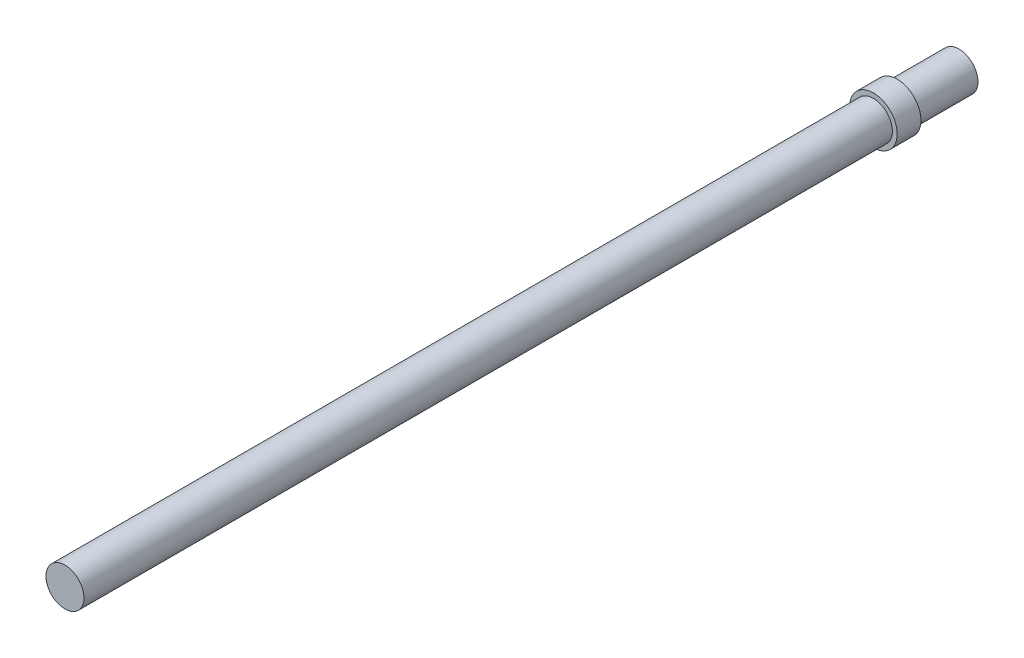
ISO-10303-21;
HEADER;
FILE_DESCRIPTION(('STEP AP214'),'2;1');
FILE_NAME('part.step','',(''),(''),'','','');
FILE_SCHEMA(('AUTOMOTIVE_DESIGN { 1 0 10303 214 1 1 1 1 }'));
ENDSEC;
DATA;
#1=APPLICATION_CONTEXT('core data for automotive mechanical design processes');
#2=APPLICATION_PROTOCOL_DEFINITION('international standard','automotive_design',2000,#1);
#3=PRODUCT_CONTEXT('',#1,'mechanical');
#4=PRODUCT('Part','Part','',(#3));
#5=PRODUCT_RELATED_PRODUCT_CATEGORY('part','',(#4));
#6=PRODUCT_DEFINITION_FORMATION('','',#4);
#7=PRODUCT_DEFINITION_CONTEXT('part definition',#1,'design');
#8=PRODUCT_DEFINITION('design','',#6,#7);
#9=PRODUCT_DEFINITION_SHAPE('','',#8);
#10=(LENGTH_UNIT() NAMED_UNIT(*) SI_UNIT(.MILLI.,.METRE.));
#11=(NAMED_UNIT(*) PLANE_ANGLE_UNIT() SI_UNIT($,.RADIAN.));
#12=(NAMED_UNIT(*) SI_UNIT($,.STERADIAN.) SOLID_ANGLE_UNIT());
#13=UNCERTAINTY_MEASURE_WITH_UNIT(LENGTH_MEASURE(1.E-05),#10,'distance_accuracy_value','');
#14=(GEOMETRIC_REPRESENTATION_CONTEXT(3) GLOBAL_UNCERTAINTY_ASSIGNED_CONTEXT((#13)) GLOBAL_UNIT_ASSIGNED_CONTEXT((#10,
#11,#12)) REPRESENTATION_CONTEXT('',''));
#15=CARTESIAN_POINT('',(0.,0.,0.));
#16=DIRECTION('',(0.,0.,1.));
#17=DIRECTION('',(1.,0.,0.));
#18=AXIS2_PLACEMENT_3D('',#15,#16,#17);
#19=CARTESIAN_POINT('',(0.,0.,170.));
#20=DIRECTION('',(0.,0.,-1.));
#21=DIRECTION('',(-1.,0.,0.));
#22=AXIS2_PLACEMENT_3D('',#19,#20,#21);
#23=CYLINDRICAL_SURFACE('',#22,4.);
#24=CARTESIAN_POINT('',(0.,0.,170.));
#25=DIRECTION('',(0.,0.,1.));
#26=DIRECTION('',(1.,0.,0.));
#27=AXIS2_PLACEMENT_3D('',#24,#25,#26);
#28=CIRCLE('',#27,4.);
#29=CARTESIAN_POINT('',(4.,0.,170.));
#30=VERTEX_POINT('',#29);
#31=EDGE_CURVE('E10',#30,#30,#28,.T.);
#32=ORIENTED_EDGE('',*,*,#31,.F.);
#33=EDGE_LOOP('',(#32));
#34=FACE_BOUND('',#33,.T.);
#35=CARTESIAN_POINT('',(0.,0.,0.));
#36=DIRECTION('',(0.,0.,1.));
#37=DIRECTION('',(1.,0.,0.));
#38=AXIS2_PLACEMENT_3D('',#35,#36,#37);
#39=CIRCLE('',#38,4.);
#40=CARTESIAN_POINT('',(4.,0.,0.));
#41=VERTEX_POINT('',#40);
#42=EDGE_CURVE('E36',#41,#41,#39,.T.);
#43=ORIENTED_EDGE('',*,*,#42,.T.);
#44=EDGE_LOOP('',(#43));
#45=FACE_BOUND('',#44,.T.);
#46=ADVANCED_FACE('F30',(#34,#45),#23,.T.);
#47=CARTESIAN_POINT('',(0.,0.,170.));
#48=DIRECTION('',(0.,0.,1.));
#49=DIRECTION('',(1.,0.,0.));
#50=AXIS2_PLACEMENT_3D('',#47,#48,#49);
#51=PLANE('',#50);
#52=ORIENTED_EDGE('',*,*,#31,.T.);
#53=EDGE_LOOP('',(#52));
#54=FACE_BOUND('',#53,.T.);
#55=ADVANCED_FACE('F68',(#54),#51,.T.);
#56=CARTESIAN_POINT('',(0.,0.,-5.));
#57=DIRECTION('',(0.,0.,1.));
#58=DIRECTION('',(1.,0.,0.));
#59=AXIS2_PLACEMENT_3D('',#56,#57,#58);
#60=CYLINDRICAL_SURFACE('',#59,5.);
#61=CARTESIAN_POINT('',(0.,0.,-5.));
#62=DIRECTION('',(0.,0.,1.));
#63=DIRECTION('',(1.,0.,0.));
#64=AXIS2_PLACEMENT_3D('',#61,#62,#63);
#65=CIRCLE('',#64,5.);
#66=CARTESIAN_POINT('',(5.,0.,-5.));
#67=VERTEX_POINT('',#66);
#68=EDGE_CURVE('E40',#67,#67,#65,.T.);
#69=ORIENTED_EDGE('',*,*,#68,.T.);
#70=EDGE_LOOP('',(#69));
#71=FACE_BOUND('',#70,.T.);
#72=CARTESIAN_POINT('',(0.,0.,0.));
#73=DIRECTION('',(0.,0.,1.));
#74=DIRECTION('',(1.,0.,0.));
#75=AXIS2_PLACEMENT_3D('',#72,#73,#74);
#76=CIRCLE('',#75,5.);
#77=CARTESIAN_POINT('',(5.,0.,0.));
#78=VERTEX_POINT('',#77);
#79=EDGE_CURVE('E44',#78,#78,#76,.T.);
#80=ORIENTED_EDGE('',*,*,#79,.F.);
#81=EDGE_LOOP('',(#80));
#82=FACE_BOUND('',#81,.T.);
#83=ADVANCED_FACE('F73',(#71,#82),#60,.T.);
#84=CARTESIAN_POINT('',(0.,0.,-5.));
#85=DIRECTION('',(0.,0.,1.));
#86=DIRECTION('',(1.,0.,0.));
#87=AXIS2_PLACEMENT_3D('',#84,#85,#86);
#88=PLANE('',#87);
#89=CARTESIAN_POINT('',(0.,0.,-5.));
#90=DIRECTION('',(0.,0.,1.));
#91=DIRECTION('',(1.,0.,0.));
#92=AXIS2_PLACEMENT_3D('',#89,#90,#91);
#93=CIRCLE('',#92,4.);
#94=CARTESIAN_POINT('',(4.,0.,-5.));
#95=VERTEX_POINT('',#94);
#96=EDGE_CURVE('E48',#95,#95,#93,.T.);
#97=ORIENTED_EDGE('',*,*,#96,.T.);
#98=EDGE_LOOP('',(#97));
#99=FACE_BOUND('',#98,.T.);
#100=ORIENTED_EDGE('',*,*,#68,.F.);
#101=EDGE_LOOP('',(#100));
#102=FACE_BOUND('',#101,.T.);
#103=ADVANCED_FACE('F77',(#99,#102),#88,.F.);
#104=CARTESIAN_POINT('',(0.,0.,0.));
#105=DIRECTION('',(0.,0.,1.));
#106=DIRECTION('',(1.,0.,0.));
#107=AXIS2_PLACEMENT_3D('',#104,#105,#106);
#108=PLANE('',#107);
#109=ORIENTED_EDGE('',*,*,#42,.F.);
#110=EDGE_LOOP('',(#109));
#111=FACE_BOUND('',#110,.T.);
#112=ORIENTED_EDGE('',*,*,#79,.T.);
#113=EDGE_LOOP('',(#112));
#114=FACE_BOUND('',#113,.T.);
#115=ADVANCED_FACE('F65',(#111,#114),#108,.T.);
#116=CARTESIAN_POINT('',(0.,0.,-18.));
#117=DIRECTION('',(0.,0.,1.));
#118=DIRECTION('',(1.,0.,0.));
#119=AXIS2_PLACEMENT_3D('',#116,#117,#118);
#120=CYLINDRICAL_SURFACE('',#119,4.);
#121=CARTESIAN_POINT('',(0.,0.,-18.));
#122=DIRECTION('',(0.,0.,1.));
#123=DIRECTION('',(1.,0.,0.));
#124=AXIS2_PLACEMENT_3D('',#121,#122,#123);
#125=CIRCLE('',#124,4.);
#126=CARTESIAN_POINT('',(4.,0.,-18.));
#127=VERTEX_POINT('',#126);
#128=EDGE_CURVE('E52',#127,#127,#125,.T.);
#129=ORIENTED_EDGE('',*,*,#128,.T.);
#130=EDGE_LOOP('',(#129));
#131=FACE_BOUND('',#130,.T.);
#132=ORIENTED_EDGE('',*,*,#96,.F.);
#133=EDGE_LOOP('',(#132));
#134=FACE_BOUND('',#133,.T.);
#135=ADVANCED_FACE('F56',(#131,#134),#120,.T.);
#136=CARTESIAN_POINT('',(0.,0.,-18.));
#137=DIRECTION('',(0.,0.,1.));
#138=DIRECTION('',(1.,0.,0.));
#139=AXIS2_PLACEMENT_3D('',#136,#137,#138);
#140=PLANE('',#139);
#141=ORIENTED_EDGE('',*,*,#128,.F.);
#142=EDGE_LOOP('',(#141));
#143=FACE_BOUND('',#142,.T.);
#144=ADVANCED_FACE('F59',(#143),#140,.F.);
#145=CLOSED_SHELL('',(#46,#55,#83,#103,#115,#135,#144));
#146=MANIFOLD_SOLID_BREP('B2',#145);
#147=ADVANCED_BREP_SHAPE_REPRESENTATION('',(#18,#146),#14);
#148=SHAPE_DEFINITION_REPRESENTATION(#9,#147);
ENDSEC;
END-ISO-10303-21;
